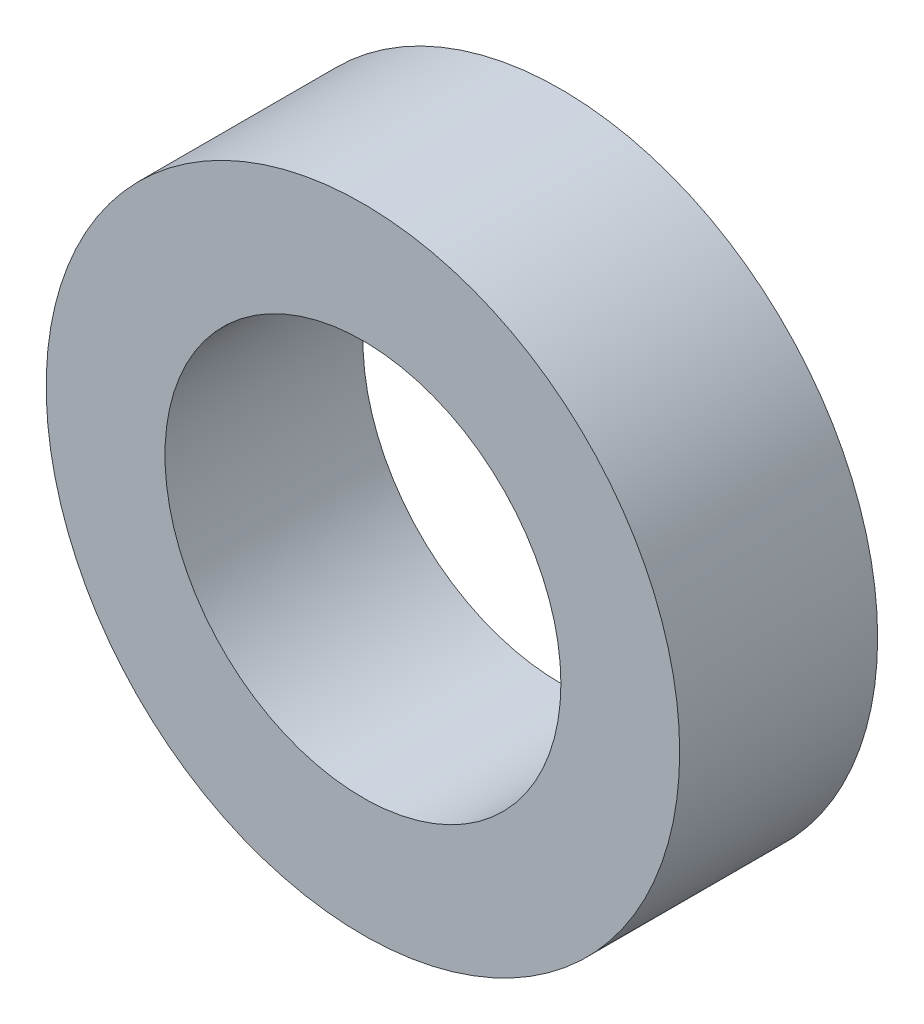
ISO-10303-21;
HEADER;
FILE_DESCRIPTION(('STEP AP214'),'2;1');
FILE_NAME('part.step','',(''),(''),'','','');
FILE_SCHEMA(('AUTOMOTIVE_DESIGN { 1 0 10303 214 1 1 1 1 }'));
ENDSEC;
DATA;
#1=APPLICATION_CONTEXT('core data for automotive mechanical design processes');
#2=APPLICATION_PROTOCOL_DEFINITION('international standard','automotive_design',2000,#1);
#3=PRODUCT_CONTEXT('',#1,'mechanical');
#4=PRODUCT('Part','Part','',(#3));
#5=PRODUCT_RELATED_PRODUCT_CATEGORY('part','',(#4));
#6=PRODUCT_DEFINITION_FORMATION('','',#4);
#7=PRODUCT_DEFINITION_CONTEXT('part definition',#1,'design');
#8=PRODUCT_DEFINITION('design','',#6,#7);
#9=PRODUCT_DEFINITION_SHAPE('','',#8);
#10=(LENGTH_UNIT() NAMED_UNIT(*) SI_UNIT(.MILLI.,.METRE.));
#11=(NAMED_UNIT(*) PLANE_ANGLE_UNIT() SI_UNIT($,.RADIAN.));
#12=(NAMED_UNIT(*) SI_UNIT($,.STERADIAN.) SOLID_ANGLE_UNIT());
#13=UNCERTAINTY_MEASURE_WITH_UNIT(LENGTH_MEASURE(1.E-05),#10,'distance_accuracy_value','');
#14=(GEOMETRIC_REPRESENTATION_CONTEXT(3) GLOBAL_UNCERTAINTY_ASSIGNED_CONTEXT((#13)) GLOBAL_UNIT_ASSIGNED_CONTEXT((#10,
#11,#12)) REPRESENTATION_CONTEXT('',''));
#15=CARTESIAN_POINT('',(0.,0.,0.));
#16=DIRECTION('',(0.,0.,1.));
#17=DIRECTION('',(1.,0.,0.));
#18=AXIS2_PLACEMENT_3D('',#15,#16,#17);
#19=CARTESIAN_POINT('',(0.,0.,2.5));
#20=DIRECTION('',(0.,0.,1.));
#21=DIRECTION('',(1.,0.,0.));
#22=AXIS2_PLACEMENT_3D('',#19,#20,#21);
#23=PLANE('',#22);
#24=CARTESIAN_POINT('',(0.,0.,2.5));
#25=DIRECTION('',(0.,0.,1.));
#26=DIRECTION('',(1.,0.,0.));
#27=AXIS2_PLACEMENT_3D('',#24,#25,#26);
#28=CIRCLE('',#27,4.);
#29=CARTESIAN_POINT('',(4.,0.,2.5));
#30=VERTEX_POINT('',#29);
#31=EDGE_CURVE('E10',#30,#30,#28,.T.);
#32=ORIENTED_EDGE('',*,*,#31,.T.);
#33=EDGE_LOOP('',(#32));
#34=FACE_BOUND('',#33,.T.);
#35=CARTESIAN_POINT('',(0.,0.,2.5));
#36=DIRECTION('',(0.,0.,1.));
#37=DIRECTION('',(1.,0.,0.));
#38=AXIS2_PLACEMENT_3D('',#35,#36,#37);
#39=CIRCLE('',#38,2.5);
#40=CARTESIAN_POINT('',(2.5,0.,2.5));
#41=VERTEX_POINT('',#40);
#42=EDGE_CURVE('E50',#41,#41,#39,.T.);
#43=ORIENTED_EDGE('',*,*,#42,.F.);
#44=EDGE_LOOP('',(#43));
#45=FACE_BOUND('',#44,.T.);
#46=ADVANCED_FACE('F39',(#34,#45),#23,.T.);
#47=CARTESIAN_POINT('',(0.,0.,0.));
#48=DIRECTION('',(0.,0.,1.));
#49=DIRECTION('',(1.,0.,0.));
#50=AXIS2_PLACEMENT_3D('',#47,#48,#49);
#51=PLANE('',#50);
#52=CARTESIAN_POINT('',(0.,0.,0.));
#53=DIRECTION('',(0.,0.,1.));
#54=DIRECTION('',(1.,0.,0.));
#55=AXIS2_PLACEMENT_3D('',#52,#53,#54);
#56=CIRCLE('',#55,4.);
#57=CARTESIAN_POINT('',(4.,0.,0.));
#58=VERTEX_POINT('',#57);
#59=EDGE_CURVE('E43',#58,#58,#56,.T.);
#60=ORIENTED_EDGE('',*,*,#59,.F.);
#61=EDGE_LOOP('',(#60));
#62=FACE_BOUND('',#61,.T.);
#63=CARTESIAN_POINT('',(0.,0.,0.));
#64=DIRECTION('',(0.,0.,1.));
#65=DIRECTION('',(1.,0.,0.));
#66=AXIS2_PLACEMENT_3D('',#63,#64,#65);
#67=CIRCLE('',#66,2.5);
#68=CARTESIAN_POINT('',(2.5,0.,0.));
#69=VERTEX_POINT('',#68);
#70=EDGE_CURVE('E52',#69,#69,#67,.T.);
#71=ORIENTED_EDGE('',*,*,#70,.T.);
#72=EDGE_LOOP('',(#71));
#73=FACE_BOUND('',#72,.T.);
#74=ADVANCED_FACE('F62',(#62,#73),#51,.F.);
#75=CARTESIAN_POINT('',(0.,0.,2.5));
#76=DIRECTION('',(0.,0.,-1.));
#77=DIRECTION('',(-1.,0.,0.));
#78=AXIS2_PLACEMENT_3D('',#75,#76,#77);
#79=CYLINDRICAL_SURFACE('',#78,4.);
#80=ORIENTED_EDGE('',*,*,#31,.F.);
#81=EDGE_LOOP('',(#80));
#82=FACE_BOUND('',#81,.T.);
#83=ORIENTED_EDGE('',*,*,#59,.T.);
#84=EDGE_LOOP('',(#83));
#85=FACE_BOUND('',#84,.T.);
#86=ADVANCED_FACE('F41',(#82,#85),#79,.T.);
#87=CARTESIAN_POINT('',(0.,0.,2.5));
#88=DIRECTION('',(0.,0.,-1.));
#89=DIRECTION('',(-1.,0.,0.));
#90=AXIS2_PLACEMENT_3D('',#87,#88,#89);
#91=CYLINDRICAL_SURFACE('',#90,2.5);
#92=ORIENTED_EDGE('',*,*,#42,.T.);
#93=EDGE_LOOP('',(#92));
#94=FACE_BOUND('',#93,.T.);
#95=ORIENTED_EDGE('',*,*,#70,.F.);
#96=EDGE_LOOP('',(#95));
#97=FACE_BOUND('',#96,.T.);
#98=ADVANCED_FACE('F58',(#94,#97),#91,.F.);
#99=CLOSED_SHELL('',(#46,#74,#86,#98));
#100=MANIFOLD_SOLID_BREP('B2',#99);
#101=ADVANCED_BREP_SHAPE_REPRESENTATION('',(#18,#100),#14);
#102=SHAPE_DEFINITION_REPRESENTATION(#9,#101);
ENDSEC;
END-ISO-10303-21;
